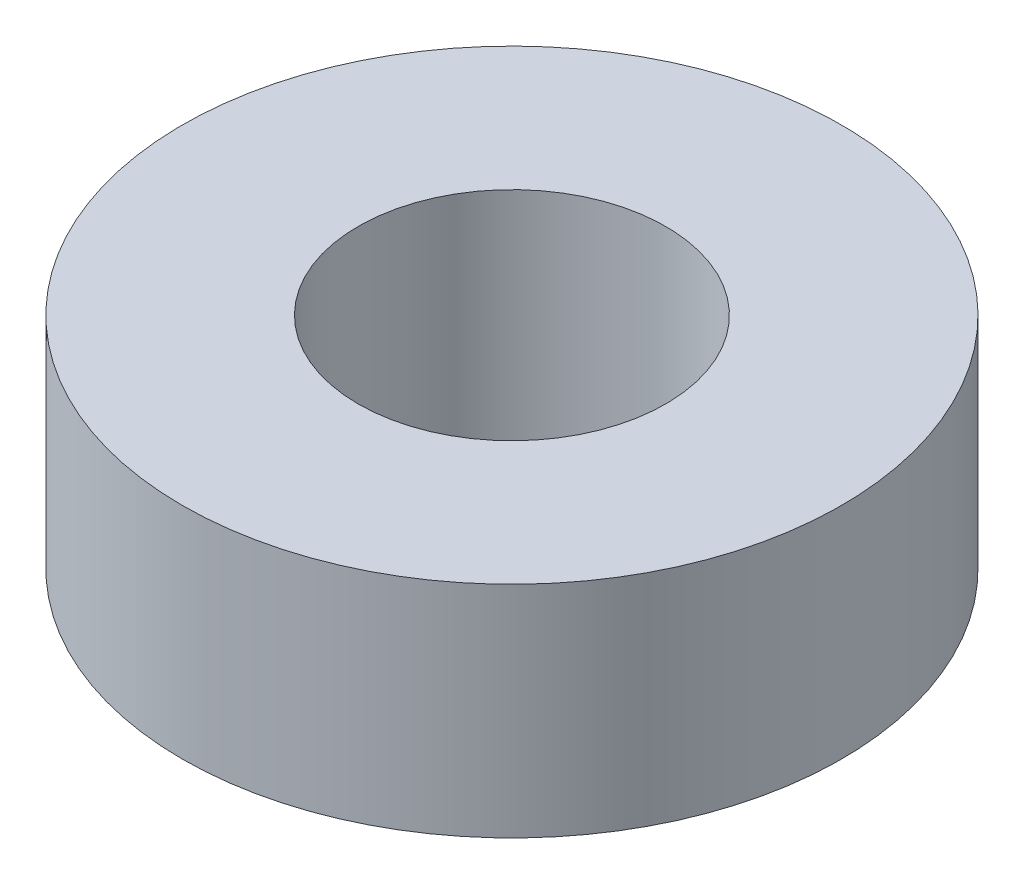
ISO-10303-21;
HEADER;
FILE_DESCRIPTION(('STEP AP214'),'2;1');
FILE_NAME('part.step','',(''),(''),'','','');
FILE_SCHEMA(('AUTOMOTIVE_DESIGN { 1 0 10303 214 1 1 1 1 }'));
ENDSEC;
DATA;
#1=APPLICATION_CONTEXT('core data for automotive mechanical design processes');
#2=APPLICATION_PROTOCOL_DEFINITION('international standard','automotive_design',2000,#1);
#3=PRODUCT_CONTEXT('',#1,'mechanical');
#4=PRODUCT('Part','Part','',(#3));
#5=PRODUCT_RELATED_PRODUCT_CATEGORY('part','',(#4));
#6=PRODUCT_DEFINITION_FORMATION('','',#4);
#7=PRODUCT_DEFINITION_CONTEXT('part definition',#1,'design');
#8=PRODUCT_DEFINITION('design','',#6,#7);
#9=PRODUCT_DEFINITION_SHAPE('','',#8);
#10=(LENGTH_UNIT() NAMED_UNIT(*) SI_UNIT(.MILLI.,.METRE.));
#11=(NAMED_UNIT(*) PLANE_ANGLE_UNIT() SI_UNIT($,.RADIAN.));
#12=(NAMED_UNIT(*) SI_UNIT($,.STERADIAN.) SOLID_ANGLE_UNIT());
#13=UNCERTAINTY_MEASURE_WITH_UNIT(LENGTH_MEASURE(1.E-05),#10,'distance_accuracy_value','');
#14=(GEOMETRIC_REPRESENTATION_CONTEXT(3) GLOBAL_UNCERTAINTY_ASSIGNED_CONTEXT((#13)) GLOBAL_UNIT_ASSIGNED_CONTEXT((#10,
#11,#12)) REPRESENTATION_CONTEXT('',''));
#15=CARTESIAN_POINT('',(0.,0.,0.));
#16=DIRECTION('',(0.,0.,1.));
#17=DIRECTION('',(1.,0.,0.));
#18=AXIS2_PLACEMENT_3D('',#15,#16,#17);
#19=CARTESIAN_POINT('',(0.,5.,0.));
#20=DIRECTION('',(0.,1.,0.));
#21=DIRECTION('',(0.,0.,1.));
#22=AXIS2_PLACEMENT_3D('',#19,#20,#21);
#23=PLANE('',#22);
#24=CARTESIAN_POINT('',(0.,5.,0.));
#25=DIRECTION('',(0.,1.,0.));
#26=DIRECTION('',(0.,0.,1.));
#27=AXIS2_PLACEMENT_3D('',#24,#25,#26);
#28=CIRCLE('',#27,7.5);
#29=CARTESIAN_POINT('',(0.,5.,7.5));
#30=VERTEX_POINT('',#29);
#31=EDGE_CURVE('E10',#30,#30,#28,.T.);
#32=ORIENTED_EDGE('',*,*,#31,.T.);
#33=EDGE_LOOP('',(#32));
#34=FACE_BOUND('',#33,.T.);
#35=CARTESIAN_POINT('',(0.,5.,0.));
#36=DIRECTION('',(0.,1.,0.));
#37=DIRECTION('',(0.,0.,1.));
#38=AXIS2_PLACEMENT_3D('',#35,#36,#37);
#39=CIRCLE('',#38,3.5);
#40=CARTESIAN_POINT('',(0.,5.,3.5));
#41=VERTEX_POINT('',#40);
#42=EDGE_CURVE('E44',#41,#41,#39,.T.);
#43=ORIENTED_EDGE('',*,*,#42,.F.);
#44=EDGE_LOOP('',(#43));
#45=FACE_BOUND('',#44,.T.);
#46=ADVANCED_FACE('F33',(#34,#45),#23,.T.);
#47=CARTESIAN_POINT('',(0.,0.,0.));
#48=DIRECTION('',(0.,1.,0.));
#49=DIRECTION('',(0.,0.,1.));
#50=AXIS2_PLACEMENT_3D('',#47,#48,#49);
#51=PLANE('',#50);
#52=CARTESIAN_POINT('',(0.,0.,0.));
#53=DIRECTION('',(0.,1.,0.));
#54=DIRECTION('',(0.,0.,1.));
#55=AXIS2_PLACEMENT_3D('',#52,#53,#54);
#56=CIRCLE('',#55,7.5);
#57=CARTESIAN_POINT('',(0.,0.,7.5));
#58=VERTEX_POINT('',#57);
#59=EDGE_CURVE('E37',#58,#58,#56,.T.);
#60=ORIENTED_EDGE('',*,*,#59,.F.);
#61=EDGE_LOOP('',(#60));
#62=FACE_BOUND('',#61,.T.);
#63=CARTESIAN_POINT('',(0.,0.,0.));
#64=DIRECTION('',(0.,1.,0.));
#65=DIRECTION('',(0.,0.,1.));
#66=AXIS2_PLACEMENT_3D('',#63,#64,#65);
#67=CIRCLE('',#66,3.5);
#68=CARTESIAN_POINT('',(0.,0.,3.5));
#69=VERTEX_POINT('',#68);
#70=EDGE_CURVE('E46',#69,#69,#67,.T.);
#71=ORIENTED_EDGE('',*,*,#70,.T.);
#72=EDGE_LOOP('',(#71));
#73=FACE_BOUND('',#72,.T.);
#74=ADVANCED_FACE('F56',(#62,#73),#51,.F.);
#75=CARTESIAN_POINT('',(0.,5.,0.));
#76=DIRECTION('',(0.,-1.,0.));
#77=DIRECTION('',(0.,0.,-1.));
#78=AXIS2_PLACEMENT_3D('',#75,#76,#77);
#79=CYLINDRICAL_SURFACE('',#78,7.5);
#80=ORIENTED_EDGE('',*,*,#31,.F.);
#81=EDGE_LOOP('',(#80));
#82=FACE_BOUND('',#81,.T.);
#83=ORIENTED_EDGE('',*,*,#59,.T.);
#84=EDGE_LOOP('',(#83));
#85=FACE_BOUND('',#84,.T.);
#86=ADVANCED_FACE('F35',(#82,#85),#79,.T.);
#87=CARTESIAN_POINT('',(0.,5.,0.));
#88=DIRECTION('',(0.,-1.,0.));
#89=DIRECTION('',(0.,0.,-1.));
#90=AXIS2_PLACEMENT_3D('',#87,#88,#89);
#91=CYLINDRICAL_SURFACE('',#90,3.5);
#92=ORIENTED_EDGE('',*,*,#42,.T.);
#93=EDGE_LOOP('',(#92));
#94=FACE_BOUND('',#93,.T.);
#95=ORIENTED_EDGE('',*,*,#70,.F.);
#96=EDGE_LOOP('',(#95));
#97=FACE_BOUND('',#96,.T.);
#98=ADVANCED_FACE('F52',(#94,#97),#91,.F.);
#99=CLOSED_SHELL('',(#46,#74,#86,#98));
#100=MANIFOLD_SOLID_BREP('B2',#99);
#101=ADVANCED_BREP_SHAPE_REPRESENTATION('',(#18,#100),#14);
#102=SHAPE_DEFINITION_REPRESENTATION(#9,#101);
ENDSEC;
END-ISO-10303-21;
